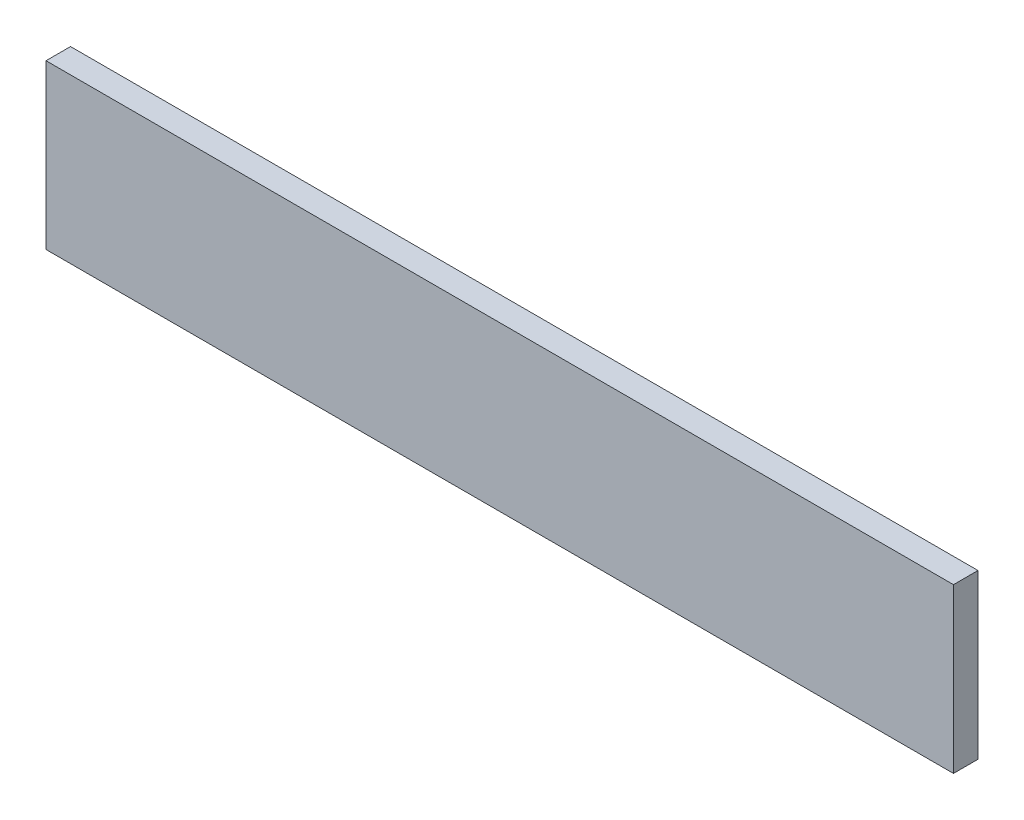
ISO-10303-21;
HEADER;
FILE_DESCRIPTION(('STEP AP214'),'2;1');
FILE_NAME('part.step','',(''),(''),'','','');
FILE_SCHEMA(('AUTOMOTIVE_DESIGN { 1 0 10303 214 1 1 1 1 }'));
ENDSEC;
DATA;
#1=APPLICATION_CONTEXT('core data for automotive mechanical design processes');
#2=APPLICATION_PROTOCOL_DEFINITION('international standard','automotive_design',2000,#1);
#3=PRODUCT_CONTEXT('',#1,'mechanical');
#4=PRODUCT('Part','Part','',(#3));
#5=PRODUCT_RELATED_PRODUCT_CATEGORY('part','',(#4));
#6=PRODUCT_DEFINITION_FORMATION('','',#4);
#7=PRODUCT_DEFINITION_CONTEXT('part definition',#1,'design');
#8=PRODUCT_DEFINITION('design','',#6,#7);
#9=PRODUCT_DEFINITION_SHAPE('','',#8);
#10=(LENGTH_UNIT() NAMED_UNIT(*) SI_UNIT(.MILLI.,.METRE.));
#11=(NAMED_UNIT(*) PLANE_ANGLE_UNIT() SI_UNIT($,.RADIAN.));
#12=(NAMED_UNIT(*) SI_UNIT($,.STERADIAN.) SOLID_ANGLE_UNIT());
#13=UNCERTAINTY_MEASURE_WITH_UNIT(LENGTH_MEASURE(1.E-05),#10,'distance_accuracy_value','');
#14=(GEOMETRIC_REPRESENTATION_CONTEXT(3) GLOBAL_UNCERTAINTY_ASSIGNED_CONTEXT((#13)) GLOBAL_UNIT_ASSIGNED_CONTEXT((#10,
#11,#12)) REPRESENTATION_CONTEXT('',''));
#15=CARTESIAN_POINT('',(0.,0.,0.));
#16=DIRECTION('',(0.,0.,1.));
#17=DIRECTION('',(1.,0.,0.));
#18=AXIS2_PLACEMENT_3D('',#15,#16,#17);
#19=CARTESIAN_POINT('',(0.,0.,19.05));
#20=DIRECTION('',(1.,0.,0.));
#21=DIRECTION('',(0.,0.,-1.));
#22=AXIS2_PLACEMENT_3D('',#19,#20,#21);
#23=PLANE('',#22);
#24=DIRECTION('',(0.,-1.,0.));
#25=VECTOR('',#24,1.);
#26=CARTESIAN_POINT('',(0.,0.,0.));
#27=LINE('',#26,#25);
#28=CARTESIAN_POINT('',(0.,127.,0.));
#29=VERTEX_POINT('',#28);
#30=CARTESIAN_POINT('',(0.,0.,0.));
#31=VERTEX_POINT('',#30);
#32=EDGE_CURVE('E107',#29,#31,#27,.T.);
#33=ORIENTED_EDGE('',*,*,#32,.T.);
#34=DIRECTION('',(0.,0.,-1.));
#35=VECTOR('',#34,1.);
#36=CARTESIAN_POINT('',(0.,0.,19.05));
#37=LINE('',#36,#35);
#38=CARTESIAN_POINT('',(0.,0.,19.05));
#39=VERTEX_POINT('',#38);
#40=EDGE_CURVE('E11',#39,#31,#37,.T.);
#41=ORIENTED_EDGE('',*,*,#40,.F.);
#42=DIRECTION('',(0.,-1.,0.));
#43=VECTOR('',#42,1.);
#44=CARTESIAN_POINT('',(0.,0.,19.05));
#45=LINE('',#44,#43);
#46=CARTESIAN_POINT('',(0.,127.,19.05));
#47=VERTEX_POINT('',#46);
#48=EDGE_CURVE('E91',#47,#39,#45,.T.);
#49=ORIENTED_EDGE('',*,*,#48,.F.);
#50=DIRECTION('',(0.,0.,-1.));
#51=VECTOR('',#50,1.);
#52=CARTESIAN_POINT('',(0.,127.,19.05));
#53=LINE('',#52,#51);
#54=EDGE_CURVE('E103',#47,#29,#53,.T.);
#55=ORIENTED_EDGE('',*,*,#54,.T.);
#56=EDGE_LOOP('',(#33,#41,#49,#55));
#57=FACE_BOUND('',#56,.T.);
#58=ADVANCED_FACE('F39',(#57),#23,.F.);
#59=CARTESIAN_POINT('',(0.,0.,19.05));
#60=DIRECTION('',(0.,1.,0.));
#61=DIRECTION('',(0.,0.,1.));
#62=AXIS2_PLACEMENT_3D('',#59,#60,#61);
#63=PLANE('',#62);
#64=DIRECTION('',(1.,0.,0.));
#65=VECTOR('',#64,1.);
#66=CARTESIAN_POINT('',(0.,0.,0.));
#67=LINE('',#66,#65);
#68=CARTESIAN_POINT('',(704.85,0.,0.));
#69=VERTEX_POINT('',#68);
#70=EDGE_CURVE('E96',#31,#69,#67,.T.);
#71=ORIENTED_EDGE('',*,*,#70,.T.);
#72=DIRECTION('',(0.,0.,-1.));
#73=VECTOR('',#72,1.);
#74=CARTESIAN_POINT('',(704.85,0.,19.05));
#75=LINE('',#74,#73);
#76=CARTESIAN_POINT('',(704.85,0.,19.05));
#77=VERTEX_POINT('',#76);
#78=EDGE_CURVE('E48',#77,#69,#75,.T.);
#79=ORIENTED_EDGE('',*,*,#78,.F.);
#80=DIRECTION('',(1.,0.,0.));
#81=VECTOR('',#80,1.);
#82=CARTESIAN_POINT('',(0.,0.,19.05));
#83=LINE('',#82,#81);
#84=EDGE_CURVE('E86',#39,#77,#83,.T.);
#85=ORIENTED_EDGE('',*,*,#84,.F.);
#86=ORIENTED_EDGE('',*,*,#40,.T.);
#87=EDGE_LOOP('',(#71,#79,#85,#86));
#88=FACE_BOUND('',#87,.T.);
#89=ADVANCED_FACE('F95',(#88),#63,.F.);
#90=CARTESIAN_POINT('',(704.85,0.,19.05));
#91=DIRECTION('',(-1.,0.,0.));
#92=DIRECTION('',(0.,0.,1.));
#93=AXIS2_PLACEMENT_3D('',#90,#91,#92);
#94=PLANE('',#93);
#95=DIRECTION('',(0.,1.,0.));
#96=VECTOR('',#95,1.);
#97=CARTESIAN_POINT('',(704.85,0.,0.));
#98=LINE('',#97,#96);
#99=CARTESIAN_POINT('',(704.85,127.,0.));
#100=VERTEX_POINT('',#99);
#101=EDGE_CURVE('E73',#69,#100,#98,.T.);
#102=ORIENTED_EDGE('',*,*,#101,.T.);
#103=DIRECTION('',(0.,0.,-1.));
#104=VECTOR('',#103,1.);
#105=CARTESIAN_POINT('',(704.85,127.,19.05));
#106=LINE('',#105,#104);
#107=CARTESIAN_POINT('',(704.85,127.,19.05));
#108=VERTEX_POINT('',#107);
#109=EDGE_CURVE('E98',#108,#100,#106,.T.);
#110=ORIENTED_EDGE('',*,*,#109,.F.);
#111=DIRECTION('',(0.,1.,0.));
#112=VECTOR('',#111,1.);
#113=CARTESIAN_POINT('',(704.85,0.,19.05));
#114=LINE('',#113,#112);
#115=EDGE_CURVE('E89',#77,#108,#114,.T.);
#116=ORIENTED_EDGE('',*,*,#115,.F.);
#117=ORIENTED_EDGE('',*,*,#78,.T.);
#118=EDGE_LOOP('',(#102,#110,#116,#117));
#119=FACE_BOUND('',#118,.T.);
#120=ADVANCED_FACE('F99',(#119),#94,.F.);
#121=CARTESIAN_POINT('',(0.,127.,19.05));
#122=DIRECTION('',(0.,-1.,0.));
#123=DIRECTION('',(0.,0.,-1.));
#124=AXIS2_PLACEMENT_3D('',#121,#122,#123);
#125=PLANE('',#124);
#126=DIRECTION('',(-1.,0.,0.));
#127=VECTOR('',#126,1.);
#128=CARTESIAN_POINT('',(0.,127.,0.));
#129=LINE('',#128,#127);
#130=EDGE_CURVE('E79',#100,#29,#129,.T.);
#131=ORIENTED_EDGE('',*,*,#130,.T.);
#132=ORIENTED_EDGE('',*,*,#54,.F.);
#133=DIRECTION('',(-1.,0.,0.));
#134=VECTOR('',#133,1.);
#135=CARTESIAN_POINT('',(0.,127.,19.05));
#136=LINE('',#135,#134);
#137=EDGE_CURVE('E56',#108,#47,#136,.T.);
#138=ORIENTED_EDGE('',*,*,#137,.F.);
#139=ORIENTED_EDGE('',*,*,#109,.T.);
#140=EDGE_LOOP('',(#131,#132,#138,#139));
#141=FACE_BOUND('',#140,.T.);
#142=ADVANCED_FACE('F120',(#141),#125,.F.);
#143=CARTESIAN_POINT('',(0.,0.,19.05));
#144=DIRECTION('',(0.,0.,-1.));
#145=DIRECTION('',(-1.,0.,0.));
#146=AXIS2_PLACEMENT_3D('',#143,#144,#145);
#147=PLANE('',#146);
#148=ORIENTED_EDGE('',*,*,#48,.T.);
#149=ORIENTED_EDGE('',*,*,#84,.T.);
#150=ORIENTED_EDGE('',*,*,#115,.T.);
#151=ORIENTED_EDGE('',*,*,#137,.T.);
#152=EDGE_LOOP('',(#148,#149,#150,#151));
#153=FACE_BOUND('',#152,.T.);
#154=ADVANCED_FACE('F87',(#153),#147,.F.);
#155=CARTESIAN_POINT('',(0.,0.,0.));
#156=DIRECTION('',(0.,0.,-1.));
#157=DIRECTION('',(-1.,0.,0.));
#158=AXIS2_PLACEMENT_3D('',#155,#156,#157);
#159=PLANE('',#158);
#160=ORIENTED_EDGE('',*,*,#32,.F.);
#161=ORIENTED_EDGE('',*,*,#130,.F.);
#162=ORIENTED_EDGE('',*,*,#101,.F.);
#163=ORIENTED_EDGE('',*,*,#70,.F.);
#164=EDGE_LOOP('',(#160,#161,#162,#163));
#165=FACE_BOUND('',#164,.T.);
#166=ADVANCED_FACE('F123',(#165),#159,.T.);
#167=CLOSED_SHELL('',(#58,#89,#120,#142,#154,#166));
#168=MANIFOLD_SOLID_BREP('B2',#167);
#169=ADVANCED_BREP_SHAPE_REPRESENTATION('',(#18,#168),#14);
#170=SHAPE_DEFINITION_REPRESENTATION(#9,#169);
ENDSEC;
END-ISO-10303-21;
